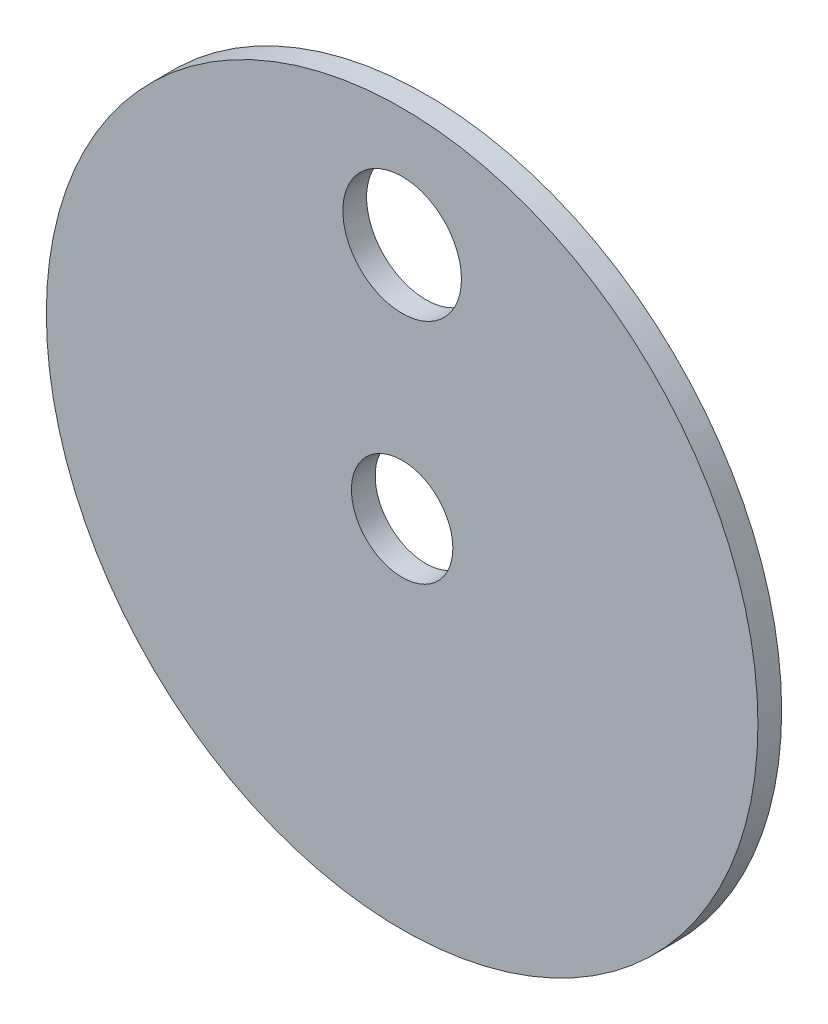
ISO-10303-21;
HEADER;
FILE_DESCRIPTION(('STEP AP214'),'2;1');
FILE_NAME('part.step','',(''),(''),'','','');
FILE_SCHEMA(('AUTOMOTIVE_DESIGN { 1 0 10303 214 1 1 1 1 }'));
ENDSEC;
DATA;
#1=APPLICATION_CONTEXT('core data for automotive mechanical design processes');
#2=APPLICATION_PROTOCOL_DEFINITION('international standard','automotive_design',2000,#1);
#3=PRODUCT_CONTEXT('',#1,'mechanical');
#4=PRODUCT('Part','Part','',(#3));
#5=PRODUCT_RELATED_PRODUCT_CATEGORY('part','',(#4));
#6=PRODUCT_DEFINITION_FORMATION('','',#4);
#7=PRODUCT_DEFINITION_CONTEXT('part definition',#1,'design');
#8=PRODUCT_DEFINITION('design','',#6,#7);
#9=PRODUCT_DEFINITION_SHAPE('','',#8);
#10=(LENGTH_UNIT() NAMED_UNIT(*) SI_UNIT(.MILLI.,.METRE.));
#11=(NAMED_UNIT(*) PLANE_ANGLE_UNIT() SI_UNIT($,.RADIAN.));
#12=(NAMED_UNIT(*) SI_UNIT($,.STERADIAN.) SOLID_ANGLE_UNIT());
#13=UNCERTAINTY_MEASURE_WITH_UNIT(LENGTH_MEASURE(1.E-05),#10,'distance_accuracy_value','');
#14=(GEOMETRIC_REPRESENTATION_CONTEXT(3) GLOBAL_UNCERTAINTY_ASSIGNED_CONTEXT((#13)) GLOBAL_UNIT_ASSIGNED_CONTEXT((#10,
#11,#12)) REPRESENTATION_CONTEXT('',''));
#15=CARTESIAN_POINT('',(0.,0.,0.));
#16=DIRECTION('',(0.,0.,1.));
#17=DIRECTION('',(1.,0.,0.));
#18=AXIS2_PLACEMENT_3D('',#15,#16,#17);
#19=CARTESIAN_POINT('',(0.,0.,10.));
#20=DIRECTION('',(0.,0.,-1.));
#21=DIRECTION('',(-1.,0.,0.));
#22=AXIS2_PLACEMENT_3D('',#19,#20,#21);
#23=CYLINDRICAL_SURFACE('',#22,150.);
#24=CARTESIAN_POINT('',(0.,0.,10.));
#25=DIRECTION('',(0.,0.,1.));
#26=DIRECTION('',(1.,0.,0.));
#27=AXIS2_PLACEMENT_3D('',#24,#25,#26);
#28=CIRCLE('',#27,150.);
#29=CARTESIAN_POINT('',(150.,0.,10.));
#30=VERTEX_POINT('',#29);
#31=EDGE_CURVE('E10',#30,#30,#28,.T.);
#32=ORIENTED_EDGE('',*,*,#31,.F.);
#33=EDGE_LOOP('',(#32));
#34=FACE_BOUND('',#33,.T.);
#35=CARTESIAN_POINT('',(0.,0.,0.));
#36=DIRECTION('',(0.,0.,1.));
#37=DIRECTION('',(1.,0.,0.));
#38=AXIS2_PLACEMENT_3D('',#35,#36,#37);
#39=CIRCLE('',#38,150.);
#40=CARTESIAN_POINT('',(150.,0.,0.));
#41=VERTEX_POINT('',#40);
#42=EDGE_CURVE('E34',#41,#41,#39,.T.);
#43=ORIENTED_EDGE('',*,*,#42,.T.);
#44=EDGE_LOOP('',(#43));
#45=FACE_BOUND('',#44,.T.);
#46=ADVANCED_FACE('F31',(#34,#45),#23,.T.);
#47=CARTESIAN_POINT('',(0.,0.,10.));
#48=DIRECTION('',(0.,0.,1.));
#49=DIRECTION('',(1.,0.,0.));
#50=AXIS2_PLACEMENT_3D('',#47,#48,#49);
#51=PLANE('',#50);
#52=CARTESIAN_POINT('',(0.,0.,10.));
#53=DIRECTION('',(0.,0.,1.));
#54=DIRECTION('',(1.,0.,0.));
#55=AXIS2_PLACEMENT_3D('',#52,#53,#54);
#56=CIRCLE('',#55,21.3761763914683);
#57=CARTESIAN_POINT('',(21.3761763914683,0.,10.));
#58=VERTEX_POINT('',#57);
#59=EDGE_CURVE('E49',#58,#58,#56,.T.);
#60=ORIENTED_EDGE('',*,*,#59,.F.);
#61=EDGE_LOOP('',(#60));
#62=FACE_BOUND('',#61,.T.);
#63=CARTESIAN_POINT('',(0.,100.,10.));
#64=DIRECTION('',(0.,0.,1.));
#65=DIRECTION('',(1.,0.,0.));
#66=AXIS2_PLACEMENT_3D('',#63,#64,#65);
#67=CIRCLE('',#66,25.);
#68=CARTESIAN_POINT('',(25.,100.,10.));
#69=VERTEX_POINT('',#68);
#70=EDGE_CURVE('E43',#69,#69,#67,.T.);
#71=ORIENTED_EDGE('',*,*,#70,.F.);
#72=EDGE_LOOP('',(#71));
#73=FACE_BOUND('',#72,.T.);
#74=ORIENTED_EDGE('',*,*,#31,.T.);
#75=EDGE_LOOP('',(#74));
#76=FACE_BOUND('',#75,.T.);
#77=ADVANCED_FACE('F65',(#62,#73,#76),#51,.T.);
#78=CARTESIAN_POINT('',(0.,0.,0.));
#79=DIRECTION('',(0.,0.,1.));
#80=DIRECTION('',(1.,0.,0.));
#81=AXIS2_PLACEMENT_3D('',#78,#79,#80);
#82=PLANE('',#81);
#83=CARTESIAN_POINT('',(0.,0.,0.));
#84=DIRECTION('',(0.,0.,1.));
#85=DIRECTION('',(1.,0.,0.));
#86=AXIS2_PLACEMENT_3D('',#83,#84,#85);
#87=CIRCLE('',#86,21.3761763914683);
#88=CARTESIAN_POINT('',(21.3761763914683,0.,0.));
#89=VERTEX_POINT('',#88);
#90=EDGE_CURVE('E41',#89,#89,#87,.T.);
#91=ORIENTED_EDGE('',*,*,#90,.T.);
#92=EDGE_LOOP('',(#91));
#93=FACE_BOUND('',#92,.T.);
#94=CARTESIAN_POINT('',(0.,100.,0.));
#95=DIRECTION('',(0.,0.,1.));
#96=DIRECTION('',(1.,0.,0.));
#97=AXIS2_PLACEMENT_3D('',#94,#95,#96);
#98=CIRCLE('',#97,25.);
#99=CARTESIAN_POINT('',(25.,100.,0.));
#100=VERTEX_POINT('',#99);
#101=EDGE_CURVE('E46',#100,#100,#98,.T.);
#102=ORIENTED_EDGE('',*,*,#101,.T.);
#103=EDGE_LOOP('',(#102));
#104=FACE_BOUND('',#103,.T.);
#105=ORIENTED_EDGE('',*,*,#42,.F.);
#106=EDGE_LOOP('',(#105));
#107=FACE_BOUND('',#106,.T.);
#108=ADVANCED_FACE('F55',(#93,#104,#107),#82,.F.);
#109=CARTESIAN_POINT('',(0.,100.,0.));
#110=DIRECTION('',(0.,0.,1.));
#111=DIRECTION('',(1.,0.,0.));
#112=AXIS2_PLACEMENT_3D('',#109,#110,#111);
#113=CYLINDRICAL_SURFACE('',#112,25.);
#114=ORIENTED_EDGE('',*,*,#101,.F.);
#115=EDGE_LOOP('',(#114));
#116=FACE_BOUND('',#115,.T.);
#117=ORIENTED_EDGE('',*,*,#70,.T.);
#118=EDGE_LOOP('',(#117));
#119=FACE_BOUND('',#118,.T.);
#120=ADVANCED_FACE('F61',(#116,#119),#113,.F.);
#121=CARTESIAN_POINT('',(0.,0.,0.));
#122=DIRECTION('',(0.,0.,1.));
#123=DIRECTION('',(1.,0.,0.));
#124=AXIS2_PLACEMENT_3D('',#121,#122,#123);
#125=CYLINDRICAL_SURFACE('',#124,21.3761763914683);
#126=ORIENTED_EDGE('',*,*,#90,.F.);
#127=EDGE_LOOP('',(#126));
#128=FACE_BOUND('',#127,.T.);
#129=ORIENTED_EDGE('',*,*,#59,.T.);
#130=EDGE_LOOP('',(#129));
#131=FACE_BOUND('',#130,.T.);
#132=ADVANCED_FACE('F58',(#128,#131),#125,.F.);
#133=CLOSED_SHELL('',(#46,#77,#108,#120,#132));
#134=MANIFOLD_SOLID_BREP('B2',#133);
#135=ADVANCED_BREP_SHAPE_REPRESENTATION('',(#18,#134),#14);
#136=SHAPE_DEFINITION_REPRESENTATION(#9,#135);
ENDSEC;
END-ISO-10303-21;
